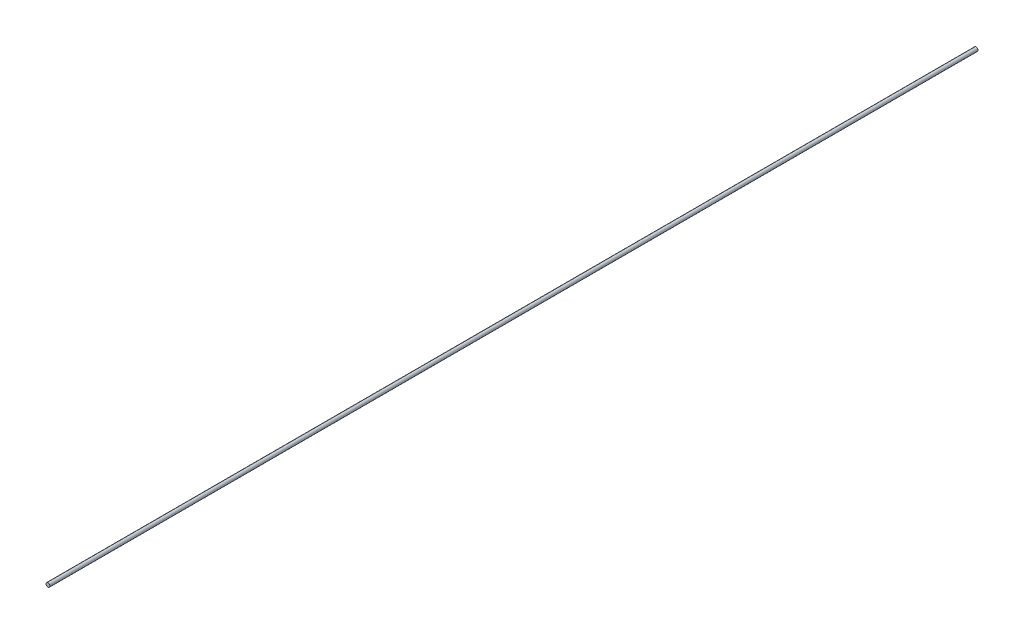
ISO-10303-21;
HEADER;
FILE_DESCRIPTION(('STEP AP214'),'2;1');
FILE_NAME('part.step','',(''),(''),'','','');
FILE_SCHEMA(('AUTOMOTIVE_DESIGN { 1 0 10303 214 1 1 1 1 }'));
ENDSEC;
DATA;
#1=APPLICATION_CONTEXT('core data for automotive mechanical design processes');
#2=APPLICATION_PROTOCOL_DEFINITION('international standard','automotive_design',2000,#1);
#3=PRODUCT_CONTEXT('',#1,'mechanical');
#4=PRODUCT('Part','Part','',(#3));
#5=PRODUCT_RELATED_PRODUCT_CATEGORY('part','',(#4));
#6=PRODUCT_DEFINITION_FORMATION('','',#4);
#7=PRODUCT_DEFINITION_CONTEXT('part definition',#1,'design');
#8=PRODUCT_DEFINITION('design','',#6,#7);
#9=PRODUCT_DEFINITION_SHAPE('','',#8);
#10=(LENGTH_UNIT() NAMED_UNIT(*) SI_UNIT(.MILLI.,.METRE.));
#11=(NAMED_UNIT(*) PLANE_ANGLE_UNIT() SI_UNIT($,.RADIAN.));
#12=(NAMED_UNIT(*) SI_UNIT($,.STERADIAN.) SOLID_ANGLE_UNIT());
#13=UNCERTAINTY_MEASURE_WITH_UNIT(LENGTH_MEASURE(1.E-05),#10,'distance_accuracy_value','');
#14=(GEOMETRIC_REPRESENTATION_CONTEXT(3) GLOBAL_UNCERTAINTY_ASSIGNED_CONTEXT((#13)) GLOBAL_UNIT_ASSIGNED_CONTEXT((#10,
#11,#12)) REPRESENTATION_CONTEXT('',''));
#15=CARTESIAN_POINT('',(0.,0.,0.));
#16=DIRECTION('',(0.,0.,1.));
#17=DIRECTION('',(1.,0.,0.));
#18=AXIS2_PLACEMENT_3D('',#15,#16,#17);
#19=CARTESIAN_POINT('',(0.,0.,762.));
#20=DIRECTION('',(0.,0.,-1.));
#21=DIRECTION('',(-1.,0.,0.));
#22=AXIS2_PLACEMENT_3D('',#19,#20,#21);
#23=CYLINDRICAL_SURFACE('',#22,1.5875);
#24=CARTESIAN_POINT('',(0.,0.,762.));
#25=DIRECTION('',(0.,0.,1.));
#26=DIRECTION('',(1.,0.,0.));
#27=AXIS2_PLACEMENT_3D('',#24,#25,#26);
#28=CIRCLE('',#27,1.5875);
#29=CARTESIAN_POINT('',(1.5875,0.,762.));
#30=VERTEX_POINT('',#29);
#31=EDGE_CURVE('E10',#30,#30,#28,.T.);
#32=ORIENTED_EDGE('',*,*,#31,.F.);
#33=EDGE_LOOP('',(#32));
#34=FACE_BOUND('',#33,.T.);
#35=CARTESIAN_POINT('',(0.,0.,0.));
#36=DIRECTION('',(0.,0.,1.));
#37=DIRECTION('',(1.,0.,0.));
#38=AXIS2_PLACEMENT_3D('',#35,#36,#37);
#39=CIRCLE('',#38,1.5875);
#40=CARTESIAN_POINT('',(1.5875,0.,0.));
#41=VERTEX_POINT('',#40);
#42=EDGE_CURVE('E40',#41,#41,#39,.T.);
#43=ORIENTED_EDGE('',*,*,#42,.T.);
#44=EDGE_LOOP('',(#43));
#45=FACE_BOUND('',#44,.T.);
#46=ADVANCED_FACE('F37',(#34,#45),#23,.T.);
#47=CARTESIAN_POINT('',(0.,0.,762.));
#48=DIRECTION('',(0.,0.,1.));
#49=DIRECTION('',(1.,0.,0.));
#50=AXIS2_PLACEMENT_3D('',#47,#48,#49);
#51=PLANE('',#50);
#52=ORIENTED_EDGE('',*,*,#31,.T.);
#53=EDGE_LOOP('',(#52));
#54=FACE_BOUND('',#53,.T.);
#55=ADVANCED_FACE('F54',(#54),#51,.T.);
#56=CARTESIAN_POINT('',(0.,0.,0.));
#57=DIRECTION('',(0.,0.,1.));
#58=DIRECTION('',(1.,0.,0.));
#59=AXIS2_PLACEMENT_3D('',#56,#57,#58);
#60=PLANE('',#59);
#61=ORIENTED_EDGE('',*,*,#42,.F.);
#62=EDGE_LOOP('',(#61));
#63=FACE_BOUND('',#62,.T.);
#64=ADVANCED_FACE('F52',(#63),#60,.F.);
#65=CLOSED_SHELL('',(#46,#55,#64));
#66=MANIFOLD_SOLID_BREP('B2',#65);
#67=ADVANCED_BREP_SHAPE_REPRESENTATION('',(#18,#66),#14);
#68=SHAPE_DEFINITION_REPRESENTATION(#9,#67);
ENDSEC;
END-ISO-10303-21;
